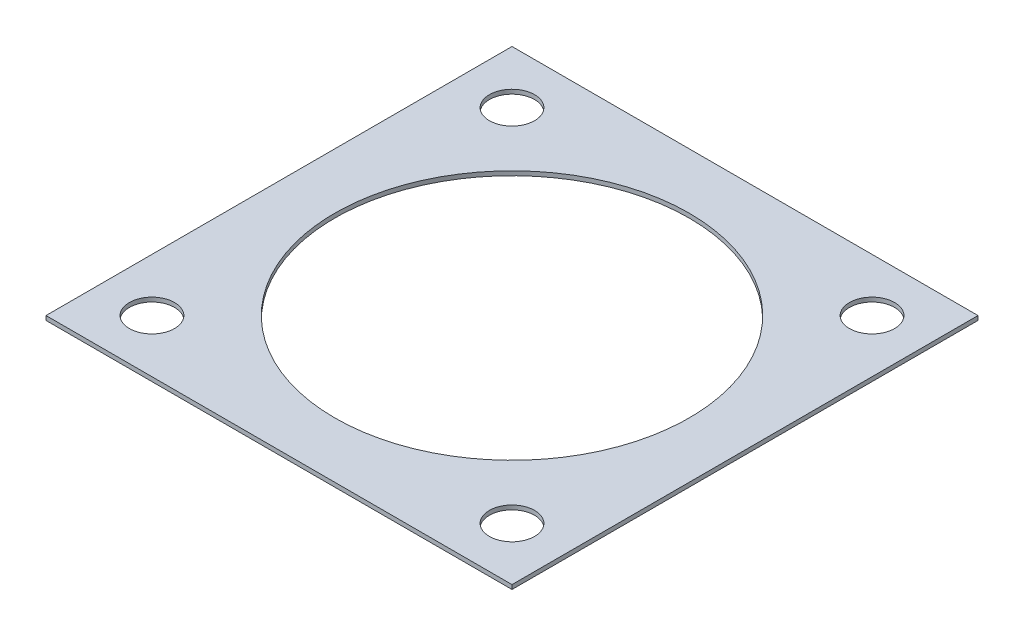
ISO-10303-21;
HEADER;
FILE_DESCRIPTION(('STEP AP214'),'2;1');
FILE_NAME('part.step','',(''),(''),'','','');
FILE_SCHEMA(('AUTOMOTIVE_DESIGN { 1 0 10303 214 1 1 1 1 }'));
ENDSEC;
DATA;
#1=APPLICATION_CONTEXT('core data for automotive mechanical design processes');
#2=APPLICATION_PROTOCOL_DEFINITION('international standard','automotive_design',2000,#1);
#3=PRODUCT_CONTEXT('',#1,'mechanical');
#4=PRODUCT('Part','Part','',(#3));
#5=PRODUCT_RELATED_PRODUCT_CATEGORY('part','',(#4));
#6=PRODUCT_DEFINITION_FORMATION('','',#4);
#7=PRODUCT_DEFINITION_CONTEXT('part definition',#1,'design');
#8=PRODUCT_DEFINITION('design','',#6,#7);
#9=PRODUCT_DEFINITION_SHAPE('','',#8);
#10=(LENGTH_UNIT() NAMED_UNIT(*) SI_UNIT(.MILLI.,.METRE.));
#11=(NAMED_UNIT(*) PLANE_ANGLE_UNIT() SI_UNIT($,.RADIAN.));
#12=(NAMED_UNIT(*) SI_UNIT($,.STERADIAN.) SOLID_ANGLE_UNIT());
#13=UNCERTAINTY_MEASURE_WITH_UNIT(LENGTH_MEASURE(1.E-05),#10,'distance_accuracy_value','');
#14=(GEOMETRIC_REPRESENTATION_CONTEXT(3) GLOBAL_UNCERTAINTY_ASSIGNED_CONTEXT((#13)) GLOBAL_UNIT_ASSIGNED_CONTEXT((#10,
#11,#12)) REPRESENTATION_CONTEXT('',''));
#15=CARTESIAN_POINT('',(0.,0.,0.));
#16=DIRECTION('',(0.,0.,1.));
#17=DIRECTION('',(1.,0.,0.));
#18=AXIS2_PLACEMENT_3D('',#15,#16,#17);
#19=CARTESIAN_POINT('',(0.,1.,0.));
#20=DIRECTION('',(0.,1.,0.));
#21=DIRECTION('',(0.,0.,1.));
#22=AXIS2_PLACEMENT_3D('',#19,#20,#21);
#23=PLANE('',#22);
#24=CARTESIAN_POINT('',(-42.1163209474439,1.,42.1163209474487));
#25=DIRECTION('',(0.,1.,0.));
#26=DIRECTION('',(0.,0.,1.));
#27=AXIS2_PLACEMENT_3D('',#24,#25,#26);
#28=CIRCLE('',#27,5.2809635526911);
#29=CARTESIAN_POINT('',(-42.1163209474439,1.,47.3972845001398));
#30=VERTEX_POINT('',#29);
#31=EDGE_CURVE('E129',#30,#30,#28,.T.);
#32=ORIENTED_EDGE('',*,*,#31,.F.);
#33=EDGE_LOOP('',(#32));
#34=FACE_BOUND('',#33,.T.);
#35=CARTESIAN_POINT('',(42.1163209474463,1.,-42.1163209474463));
#36=DIRECTION('',(0.,1.,0.));
#37=DIRECTION('',(0.,0.,1.));
#38=AXIS2_PLACEMENT_3D('',#35,#36,#37);
#39=CIRCLE('',#38,5.28096355268931);
#40=CARTESIAN_POINT('',(42.1163209474463,1.,-36.835357394757));
#41=VERTEX_POINT('',#40);
#42=EDGE_CURVE('E117',#41,#41,#39,.T.);
#43=ORIENTED_EDGE('',*,*,#42,.F.);
#44=EDGE_LOOP('',(#43));
#45=FACE_BOUND('',#44,.T.);
#46=DIRECTION('',(0.,0.,-1.));
#47=VECTOR('',#46,1.);
#48=CARTESIAN_POINT('',(54.5113141376758,1.,-54.5113141376758));
#49=LINE('',#48,#47);
#50=CARTESIAN_POINT('',(54.5113141376758,1.,54.5113141376758));
#51=VERTEX_POINT('',#50);
#52=CARTESIAN_POINT('',(54.5113141376758,1.,-54.5113141376758));
#53=VERTEX_POINT('',#52);
#54=EDGE_CURVE('E87',#51,#53,#49,.T.);
#55=ORIENTED_EDGE('',*,*,#54,.T.);
#56=DIRECTION('',(-1.,0.,0.));
#57=VECTOR('',#56,1.);
#58=CARTESIAN_POINT('',(-54.5113141376758,1.,-54.5113141376758));
#59=LINE('',#58,#57);
#60=CARTESIAN_POINT('',(-54.5113141376758,1.,-54.5113141376758));
#61=VERTEX_POINT('',#60);
#62=EDGE_CURVE('E82',#53,#61,#59,.T.);
#63=ORIENTED_EDGE('',*,*,#62,.T.);
#64=DIRECTION('',(0.,0.,1.));
#65=VECTOR('',#64,1.);
#66=CARTESIAN_POINT('',(-54.5113141376758,1.,-54.5113141376758));
#67=LINE('',#66,#65);
#68=CARTESIAN_POINT('',(-54.5113141376758,1.,54.5113141376758));
#69=VERTEX_POINT('',#68);
#70=EDGE_CURVE('E85',#61,#69,#67,.T.);
#71=ORIENTED_EDGE('',*,*,#70,.T.);
#72=DIRECTION('',(1.,0.,0.));
#73=VECTOR('',#72,1.);
#74=CARTESIAN_POINT('',(-54.5113141376758,1.,54.5113141376758));
#75=LINE('',#74,#73);
#76=EDGE_CURVE('E52',#69,#51,#75,.T.);
#77=ORIENTED_EDGE('',*,*,#76,.T.);
#78=EDGE_LOOP('',(#55,#63,#71,#77));
#79=FACE_BOUND('',#78,.T.);
#80=CARTESIAN_POINT('',(0.,1.,0.));
#81=DIRECTION('',(0.,1.,0.));
#82=DIRECTION('',(0.,0.,1.));
#83=AXIS2_PLACEMENT_3D('',#80,#81,#82);
#84=CIRCLE('',#83,41.4775558212605);
#85=CARTESIAN_POINT('',(0.,1.,41.4775558212605));
#86=VERTEX_POINT('',#85);
#87=EDGE_CURVE('E102',#86,#86,#84,.T.);
#88=ORIENTED_EDGE('',*,*,#87,.F.);
#89=EDGE_LOOP('',(#88));
#90=FACE_BOUND('',#89,.T.);
#91=CARTESIAN_POINT('',(42.1163209474487,1.,42.1163209474463));
#92=DIRECTION('',(0.,1.,0.));
#93=DIRECTION('',(0.,0.,1.));
#94=AXIS2_PLACEMENT_3D('',#91,#92,#93);
#95=CIRCLE('',#94,5.28096355268872);
#96=CARTESIAN_POINT('',(42.1163209474487,1.,47.3972845001351));
#97=VERTEX_POINT('',#96);
#98=EDGE_CURVE('E123',#97,#97,#95,.T.);
#99=ORIENTED_EDGE('',*,*,#98,.F.);
#100=EDGE_LOOP('',(#99));
#101=FACE_BOUND('',#100,.T.);
#102=CARTESIAN_POINT('',(-42.1163209474464,1.,-42.1163209474439));
#103=DIRECTION('',(0.,1.,0.));
#104=DIRECTION('',(0.,0.,1.));
#105=AXIS2_PLACEMENT_3D('',#102,#103,#104);
#106=CIRCLE('',#105,5.2809635526919);
#107=CARTESIAN_POINT('',(-42.1163209474464,1.,-36.8353573947521));
#108=VERTEX_POINT('',#107);
#109=EDGE_CURVE('E135',#108,#108,#106,.T.);
#110=ORIENTED_EDGE('',*,*,#109,.F.);
#111=EDGE_LOOP('',(#110));
#112=FACE_BOUND('',#111,.T.);
#113=ADVANCED_FACE('F35',(#34,#45,#79,#90,#101,#112),#23,.T.);
#114=CARTESIAN_POINT('',(0.,0.,0.));
#115=DIRECTION('',(0.,1.,0.));
#116=DIRECTION('',(0.,0.,1.));
#117=AXIS2_PLACEMENT_3D('',#114,#115,#116);
#118=PLANE('',#117);
#119=CARTESIAN_POINT('',(-42.1163209474439,0.,42.1163209474487));
#120=DIRECTION('',(0.,1.,0.));
#121=DIRECTION('',(0.,0.,1.));
#122=AXIS2_PLACEMENT_3D('',#119,#120,#121);
#123=CIRCLE('',#122,5.2809635526911);
#124=CARTESIAN_POINT('',(-42.1163209474439,0.,47.3972845001398));
#125=VERTEX_POINT('',#124);
#126=EDGE_CURVE('E132',#125,#125,#123,.T.);
#127=ORIENTED_EDGE('',*,*,#126,.T.);
#128=EDGE_LOOP('',(#127));
#129=FACE_BOUND('',#128,.T.);
#130=CARTESIAN_POINT('',(42.1163209474463,0.,-42.1163209474463));
#131=DIRECTION('',(0.,1.,0.));
#132=DIRECTION('',(0.,0.,1.));
#133=AXIS2_PLACEMENT_3D('',#130,#131,#132);
#134=CIRCLE('',#133,5.28096355268931);
#135=CARTESIAN_POINT('',(42.1163209474463,0.,-36.835357394757));
#136=VERTEX_POINT('',#135);
#137=EDGE_CURVE('E120',#136,#136,#134,.T.);
#138=ORIENTED_EDGE('',*,*,#137,.T.);
#139=EDGE_LOOP('',(#138));
#140=FACE_BOUND('',#139,.T.);
#141=DIRECTION('',(0.,0.,-1.));
#142=VECTOR('',#141,1.);
#143=CARTESIAN_POINT('',(54.5113141376758,0.,-54.5113141376758));
#144=LINE('',#143,#142);
#145=CARTESIAN_POINT('',(54.5113141376758,0.,54.5113141376758));
#146=VERTEX_POINT('',#145);
#147=CARTESIAN_POINT('',(54.5113141376758,0.,-54.5113141376758));
#148=VERTEX_POINT('',#147);
#149=EDGE_CURVE('E99',#146,#148,#144,.T.);
#150=ORIENTED_EDGE('',*,*,#149,.F.);
#151=DIRECTION('',(1.,0.,0.));
#152=VECTOR('',#151,1.);
#153=CARTESIAN_POINT('',(-54.5113141376758,0.,54.5113141376758));
#154=LINE('',#153,#152);
#155=CARTESIAN_POINT('',(-54.5113141376758,0.,54.5113141376758));
#156=VERTEX_POINT('',#155);
#157=EDGE_CURVE('E75',#156,#146,#154,.T.);
#158=ORIENTED_EDGE('',*,*,#157,.F.);
#159=DIRECTION('',(0.,0.,1.));
#160=VECTOR('',#159,1.);
#161=CARTESIAN_POINT('',(-54.5113141376758,0.,-54.5113141376758));
#162=LINE('',#161,#160);
#163=CARTESIAN_POINT('',(-54.5113141376758,0.,-54.5113141376758));
#164=VERTEX_POINT('',#163);
#165=EDGE_CURVE('E69',#164,#156,#162,.T.);
#166=ORIENTED_EDGE('',*,*,#165,.F.);
#167=DIRECTION('',(-1.,0.,0.));
#168=VECTOR('',#167,1.);
#169=CARTESIAN_POINT('',(-54.5113141376758,0.,-54.5113141376758));
#170=LINE('',#169,#168);
#171=EDGE_CURVE('E91',#148,#164,#170,.T.);
#172=ORIENTED_EDGE('',*,*,#171,.F.);
#173=EDGE_LOOP('',(#150,#158,#166,#172));
#174=FACE_BOUND('',#173,.T.);
#175=CARTESIAN_POINT('',(0.,0.,0.));
#176=DIRECTION('',(0.,1.,0.));
#177=DIRECTION('',(0.,0.,1.));
#178=AXIS2_PLACEMENT_3D('',#175,#176,#177);
#179=CIRCLE('',#178,41.4775558212605);
#180=CARTESIAN_POINT('',(0.,0.,41.4775558212605));
#181=VERTEX_POINT('',#180);
#182=EDGE_CURVE('E114',#181,#181,#179,.T.);
#183=ORIENTED_EDGE('',*,*,#182,.T.);
#184=EDGE_LOOP('',(#183));
#185=FACE_BOUND('',#184,.T.);
#186=CARTESIAN_POINT('',(42.1163209474487,0.,42.1163209474463));
#187=DIRECTION('',(0.,1.,0.));
#188=DIRECTION('',(0.,0.,1.));
#189=AXIS2_PLACEMENT_3D('',#186,#187,#188);
#190=CIRCLE('',#189,5.28096355268872);
#191=CARTESIAN_POINT('',(42.1163209474487,0.,47.3972845001351));
#192=VERTEX_POINT('',#191);
#193=EDGE_CURVE('E126',#192,#192,#190,.T.);
#194=ORIENTED_EDGE('',*,*,#193,.T.);
#195=EDGE_LOOP('',(#194));
#196=FACE_BOUND('',#195,.T.);
#197=CARTESIAN_POINT('',(-42.1163209474464,0.,-42.1163209474439));
#198=DIRECTION('',(0.,1.,0.));
#199=DIRECTION('',(0.,0.,1.));
#200=AXIS2_PLACEMENT_3D('',#197,#198,#199);
#201=CIRCLE('',#200,5.2809635526919);
#202=CARTESIAN_POINT('',(-42.1163209474464,0.,-36.8353573947521));
#203=VERTEX_POINT('',#202);
#204=EDGE_CURVE('E138',#203,#203,#201,.T.);
#205=ORIENTED_EDGE('',*,*,#204,.T.);
#206=EDGE_LOOP('',(#205));
#207=FACE_BOUND('',#206,.T.);
#208=ADVANCED_FACE('F110',(#129,#140,#174,#185,#196,#207),#118,.F.);
#209=CARTESIAN_POINT('',(54.5113141376758,1.,-54.5113141376758));
#210=DIRECTION('',(-1.,0.,0.));
#211=DIRECTION('',(0.,0.,1.));
#212=AXIS2_PLACEMENT_3D('',#209,#210,#211);
#213=PLANE('',#212);
#214=ORIENTED_EDGE('',*,*,#149,.T.);
#215=DIRECTION('',(0.,-1.,0.));
#216=VECTOR('',#215,1.);
#217=CARTESIAN_POINT('',(54.5113141376758,1.,-54.5113141376758));
#218=LINE('',#217,#216);
#219=EDGE_CURVE('E11',#53,#148,#218,.T.);
#220=ORIENTED_EDGE('',*,*,#219,.F.);
#221=ORIENTED_EDGE('',*,*,#54,.F.);
#222=DIRECTION('',(0.,-1.,0.));
#223=VECTOR('',#222,1.);
#224=CARTESIAN_POINT('',(54.5113141376758,1.,54.5113141376758));
#225=LINE('',#224,#223);
#226=EDGE_CURVE('E95',#51,#146,#225,.T.);
#227=ORIENTED_EDGE('',*,*,#226,.T.);
#228=EDGE_LOOP('',(#214,#220,#221,#227));
#229=FACE_BOUND('',#228,.T.);
#230=ADVANCED_FACE('F37',(#229),#213,.F.);
#231=CARTESIAN_POINT('',(-54.5113141376758,1.,-54.5113141376758));
#232=DIRECTION('',(0.,0.,1.));
#233=DIRECTION('',(1.,0.,0.));
#234=AXIS2_PLACEMENT_3D('',#231,#232,#233);
#235=PLANE('',#234);
#236=ORIENTED_EDGE('',*,*,#171,.T.);
#237=DIRECTION('',(0.,-1.,0.));
#238=VECTOR('',#237,1.);
#239=CARTESIAN_POINT('',(-54.5113141376758,1.,-54.5113141376758));
#240=LINE('',#239,#238);
#241=EDGE_CURVE('E44',#61,#164,#240,.T.);
#242=ORIENTED_EDGE('',*,*,#241,.F.);
#243=ORIENTED_EDGE('',*,*,#62,.F.);
#244=ORIENTED_EDGE('',*,*,#219,.T.);
#245=EDGE_LOOP('',(#236,#242,#243,#244));
#246=FACE_BOUND('',#245,.T.);
#247=ADVANCED_FACE('F90',(#246),#235,.F.);
#248=CARTESIAN_POINT('',(-54.5113141376758,1.,-54.5113141376758));
#249=DIRECTION('',(1.,0.,0.));
#250=DIRECTION('',(0.,0.,-1.));
#251=AXIS2_PLACEMENT_3D('',#248,#249,#250);
#252=PLANE('',#251);
#253=ORIENTED_EDGE('',*,*,#165,.T.);
#254=DIRECTION('',(0.,-1.,0.));
#255=VECTOR('',#254,1.);
#256=CARTESIAN_POINT('',(-54.5113141376758,1.,54.5113141376758));
#257=LINE('',#256,#255);
#258=EDGE_CURVE('E92',#69,#156,#257,.T.);
#259=ORIENTED_EDGE('',*,*,#258,.F.);
#260=ORIENTED_EDGE('',*,*,#70,.F.);
#261=ORIENTED_EDGE('',*,*,#241,.T.);
#262=EDGE_LOOP('',(#253,#259,#260,#261));
#263=FACE_BOUND('',#262,.T.);
#264=ADVANCED_FACE('F93',(#263),#252,.F.);
#265=CARTESIAN_POINT('',(-54.5113141376758,1.,54.5113141376758));
#266=DIRECTION('',(0.,0.,-1.));
#267=DIRECTION('',(-1.,0.,0.));
#268=AXIS2_PLACEMENT_3D('',#265,#266,#267);
#269=PLANE('',#268);
#270=ORIENTED_EDGE('',*,*,#157,.T.);
#271=ORIENTED_EDGE('',*,*,#226,.F.);
#272=ORIENTED_EDGE('',*,*,#76,.F.);
#273=ORIENTED_EDGE('',*,*,#258,.T.);
#274=EDGE_LOOP('',(#270,#271,#272,#273));
#275=FACE_BOUND('',#274,.T.);
#276=ADVANCED_FACE('F107',(#275),#269,.F.);
#277=CARTESIAN_POINT('',(0.,1.,0.));
#278=DIRECTION('',(0.,-1.,0.));
#279=DIRECTION('',(0.,0.,-1.));
#280=AXIS2_PLACEMENT_3D('',#277,#278,#279);
#281=CYLINDRICAL_SURFACE('',#280,41.4775558212605);
#282=ORIENTED_EDGE('',*,*,#87,.T.);
#283=EDGE_LOOP('',(#282));
#284=FACE_BOUND('',#283,.T.);
#285=ORIENTED_EDGE('',*,*,#182,.F.);
#286=EDGE_LOOP('',(#285));
#287=FACE_BOUND('',#286,.T.);
#288=ADVANCED_FACE('F158',(#284,#287),#281,.F.);
#289=CARTESIAN_POINT('',(42.1163209474463,1.,-42.1163209474463));
#290=DIRECTION('',(0.,-1.,0.));
#291=DIRECTION('',(0.,0.,-1.));
#292=AXIS2_PLACEMENT_3D('',#289,#290,#291);
#293=CYLINDRICAL_SURFACE('',#292,5.28096355268931);
#294=ORIENTED_EDGE('',*,*,#42,.T.);
#295=EDGE_LOOP('',(#294));
#296=FACE_BOUND('',#295,.T.);
#297=ORIENTED_EDGE('',*,*,#137,.F.);
#298=EDGE_LOOP('',(#297));
#299=FACE_BOUND('',#298,.T.);
#300=ADVANCED_FACE('F204',(#296,#299),#293,.F.);
#301=CARTESIAN_POINT('',(42.1163209474487,1.,42.1163209474463));
#302=DIRECTION('',(0.,-1.,0.));
#303=DIRECTION('',(0.,0.,-1.));
#304=AXIS2_PLACEMENT_3D('',#301,#302,#303);
#305=CYLINDRICAL_SURFACE('',#304,5.28096355268872);
#306=ORIENTED_EDGE('',*,*,#98,.T.);
#307=EDGE_LOOP('',(#306));
#308=FACE_BOUND('',#307,.T.);
#309=ORIENTED_EDGE('',*,*,#193,.F.);
#310=EDGE_LOOP('',(#309));
#311=FACE_BOUND('',#310,.T.);
#312=ADVANCED_FACE('F212',(#308,#311),#305,.F.);
#313=CARTESIAN_POINT('',(-42.1163209474439,1.,42.1163209474487));
#314=DIRECTION('',(0.,-1.,0.));
#315=DIRECTION('',(0.,0.,-1.));
#316=AXIS2_PLACEMENT_3D('',#313,#314,#315);
#317=CYLINDRICAL_SURFACE('',#316,5.2809635526911);
#318=ORIENTED_EDGE('',*,*,#31,.T.);
#319=EDGE_LOOP('',(#318));
#320=FACE_BOUND('',#319,.T.);
#321=ORIENTED_EDGE('',*,*,#126,.F.);
#322=EDGE_LOOP('',(#321));
#323=FACE_BOUND('',#322,.T.);
#324=ADVANCED_FACE('F220',(#320,#323),#317,.F.);
#325=CARTESIAN_POINT('',(-42.1163209474464,1.,-42.1163209474439));
#326=DIRECTION('',(0.,-1.,0.));
#327=DIRECTION('',(0.,0.,-1.));
#328=AXIS2_PLACEMENT_3D('',#325,#326,#327);
#329=CYLINDRICAL_SURFACE('',#328,5.2809635526919);
#330=ORIENTED_EDGE('',*,*,#109,.T.);
#331=EDGE_LOOP('',(#330));
#332=FACE_BOUND('',#331,.T.);
#333=ORIENTED_EDGE('',*,*,#204,.F.);
#334=EDGE_LOOP('',(#333));
#335=FACE_BOUND('',#334,.T.);
#336=ADVANCED_FACE('F144',(#332,#335),#329,.F.);
#337=CLOSED_SHELL('',(#113,#208,#230,#247,#264,#276,#288,#300,#312,#324,#336));
#338=MANIFOLD_SOLID_BREP('B2',#337);
#339=ADVANCED_BREP_SHAPE_REPRESENTATION('',(#18,#338),#14);
#340=SHAPE_DEFINITION_REPRESENTATION(#9,#339);
ENDSEC;
END-ISO-10303-21;
